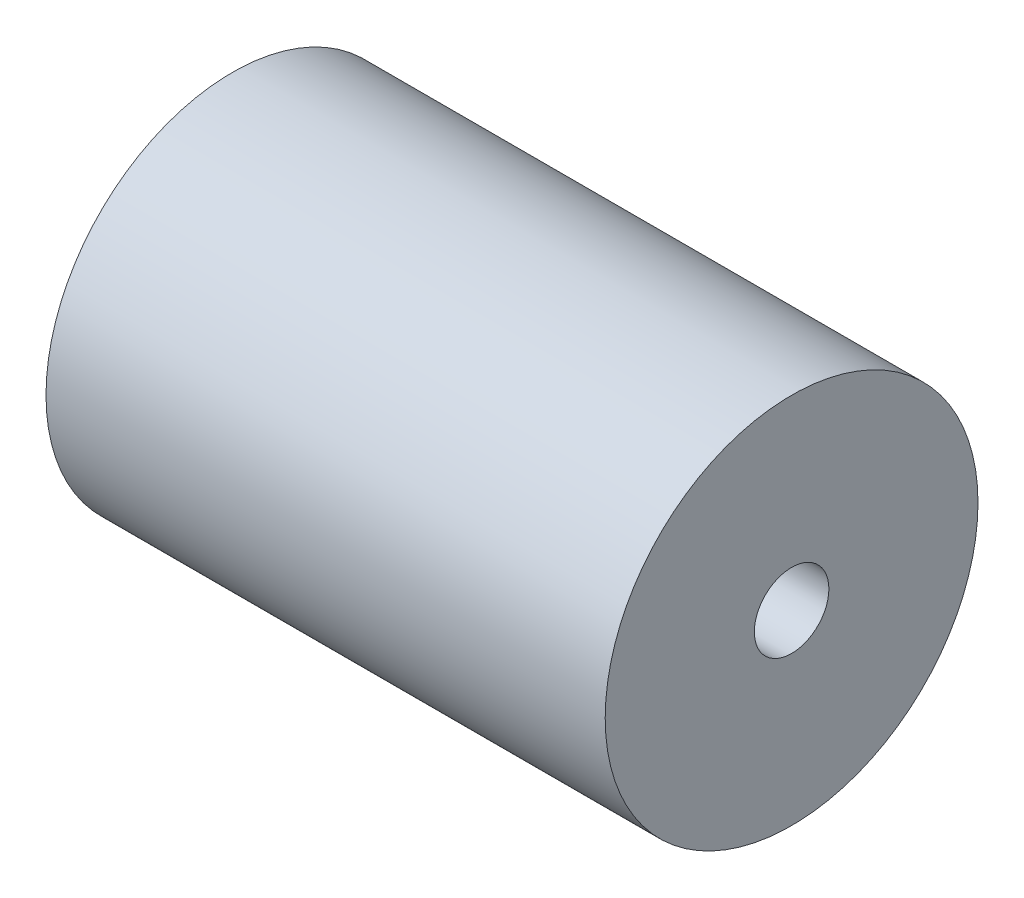
ISO-10303-21;
HEADER;
FILE_DESCRIPTION(('STEP AP214'),'2;1');
FILE_NAME('part.step','',(''),(''),'','','');
FILE_SCHEMA(('AUTOMOTIVE_DESIGN { 1 0 10303 214 1 1 1 1 }'));
ENDSEC;
DATA;
#1=APPLICATION_CONTEXT('core data for automotive mechanical design processes');
#2=APPLICATION_PROTOCOL_DEFINITION('international standard','automotive_design',2000,#1);
#3=PRODUCT_CONTEXT('',#1,'mechanical');
#4=PRODUCT('Part','Part','',(#3));
#5=PRODUCT_RELATED_PRODUCT_CATEGORY('part','',(#4));
#6=PRODUCT_DEFINITION_FORMATION('','',#4);
#7=PRODUCT_DEFINITION_CONTEXT('part definition',#1,'design');
#8=PRODUCT_DEFINITION('design','',#6,#7);
#9=PRODUCT_DEFINITION_SHAPE('','',#8);
#10=(LENGTH_UNIT() NAMED_UNIT(*) SI_UNIT(.MILLI.,.METRE.));
#11=(NAMED_UNIT(*) PLANE_ANGLE_UNIT() SI_UNIT($,.RADIAN.));
#12=(NAMED_UNIT(*) SI_UNIT($,.STERADIAN.) SOLID_ANGLE_UNIT());
#13=UNCERTAINTY_MEASURE_WITH_UNIT(LENGTH_MEASURE(1.E-05),#10,'distance_accuracy_value','');
#14=(GEOMETRIC_REPRESENTATION_CONTEXT(3) GLOBAL_UNCERTAINTY_ASSIGNED_CONTEXT((#13)) GLOBAL_UNIT_ASSIGNED_CONTEXT((#10,
#11,#12)) REPRESENTATION_CONTEXT('',''));
#15=CARTESIAN_POINT('',(0.,0.,0.));
#16=DIRECTION('',(0.,0.,1.));
#17=DIRECTION('',(1.,0.,0.));
#18=AXIS2_PLACEMENT_3D('',#15,#16,#17);
#19=CARTESIAN_POINT('',(15.,0.,0.));
#20=DIRECTION('',(-1.,0.,0.));
#21=DIRECTION('',(0.,0.,1.));
#22=AXIS2_PLACEMENT_3D('',#19,#20,#21);
#23=CYLINDRICAL_SURFACE('',#22,5.);
#24=CARTESIAN_POINT('',(15.,0.,0.));
#25=DIRECTION('',(1.,0.,0.));
#26=DIRECTION('',(0.,0.,-1.));
#27=AXIS2_PLACEMENT_3D('',#24,#25,#26);
#28=CIRCLE('',#27,5.);
#29=CARTESIAN_POINT('',(15.,0.,-5.));
#30=VERTEX_POINT('',#29);
#31=EDGE_CURVE('E10',#30,#30,#28,.T.);
#32=ORIENTED_EDGE('',*,*,#31,.F.);
#33=EDGE_LOOP('',(#32));
#34=FACE_BOUND('',#33,.T.);
#35=CARTESIAN_POINT('',(0.,0.,0.));
#36=DIRECTION('',(1.,0.,0.));
#37=DIRECTION('',(0.,0.,-1.));
#38=AXIS2_PLACEMENT_3D('',#35,#36,#37);
#39=CIRCLE('',#38,5.);
#40=CARTESIAN_POINT('',(0.,0.,-5.));
#41=VERTEX_POINT('',#40);
#42=EDGE_CURVE('E40',#41,#41,#39,.T.);
#43=ORIENTED_EDGE('',*,*,#42,.T.);
#44=EDGE_LOOP('',(#43));
#45=FACE_BOUND('',#44,.T.);
#46=ADVANCED_FACE('F37',(#34,#45),#23,.T.);
#47=CARTESIAN_POINT('',(15.,0.,0.));
#48=DIRECTION('',(1.,0.,0.));
#49=DIRECTION('',(0.,0.,-1.));
#50=AXIS2_PLACEMENT_3D('',#47,#48,#49);
#51=PLANE('',#50);
#52=CARTESIAN_POINT('',(15.,0.,0.));
#53=DIRECTION('',(1.,0.,0.));
#54=DIRECTION('',(0.,0.,-1.));
#55=AXIS2_PLACEMENT_3D('',#52,#53,#54);
#56=CIRCLE('',#55,1.);
#57=CARTESIAN_POINT('',(15.,0.,-1.));
#58=VERTEX_POINT('',#57);
#59=EDGE_CURVE('E49',#58,#58,#56,.T.);
#60=ORIENTED_EDGE('',*,*,#59,.F.);
#61=EDGE_LOOP('',(#60));
#62=FACE_BOUND('',#61,.T.);
#63=ORIENTED_EDGE('',*,*,#31,.T.);
#64=EDGE_LOOP('',(#63));
#65=FACE_BOUND('',#64,.T.);
#66=ADVANCED_FACE('F64',(#62,#65),#51,.T.);
#67=CARTESIAN_POINT('',(0.,0.,0.));
#68=DIRECTION('',(1.,0.,0.));
#69=DIRECTION('',(0.,0.,-1.));
#70=AXIS2_PLACEMENT_3D('',#67,#68,#69);
#71=PLANE('',#70);
#72=ORIENTED_EDGE('',*,*,#42,.F.);
#73=EDGE_LOOP('',(#72));
#74=FACE_BOUND('',#73,.T.);
#75=ADVANCED_FACE('F60',(#74),#71,.F.);
#76=CARTESIAN_POINT('',(5.,0.,0.));
#77=DIRECTION('',(1.,0.,0.));
#78=DIRECTION('',(0.,0.,-1.));
#79=AXIS2_PLACEMENT_3D('',#76,#77,#78);
#80=CYLINDRICAL_SURFACE('',#79,1.);
#81=CARTESIAN_POINT('',(5.,0.,0.));
#82=DIRECTION('',(1.,0.,0.));
#83=DIRECTION('',(0.,0.,-1.));
#84=AXIS2_PLACEMENT_3D('',#81,#82,#83);
#85=CIRCLE('',#84,1.);
#86=CARTESIAN_POINT('',(5.,0.,-1.));
#87=VERTEX_POINT('',#86);
#88=EDGE_CURVE('E47',#87,#87,#85,.T.);
#89=ORIENTED_EDGE('',*,*,#88,.F.);
#90=EDGE_LOOP('',(#89));
#91=FACE_BOUND('',#90,.T.);
#92=ORIENTED_EDGE('',*,*,#59,.T.);
#93=EDGE_LOOP('',(#92));
#94=FACE_BOUND('',#93,.T.);
#95=ADVANCED_FACE('F57',(#91,#94),#80,.F.);
#96=CARTESIAN_POINT('',(5.,0.,0.));
#97=DIRECTION('',(1.,0.,0.));
#98=DIRECTION('',(0.,0.,-1.));
#99=AXIS2_PLACEMENT_3D('',#96,#97,#98);
#100=PLANE('',#99);
#101=ORIENTED_EDGE('',*,*,#88,.T.);
#102=EDGE_LOOP('',(#101));
#103=FACE_BOUND('',#102,.T.);
#104=ADVANCED_FACE('F55',(#103),#100,.T.);
#105=CLOSED_SHELL('',(#46,#66,#75,#95,#104));
#106=MANIFOLD_SOLID_BREP('B2',#105);
#107=ADVANCED_BREP_SHAPE_REPRESENTATION('',(#18,#106),#14);
#108=SHAPE_DEFINITION_REPRESENTATION(#9,#107);
ENDSEC;
END-ISO-10303-21;
